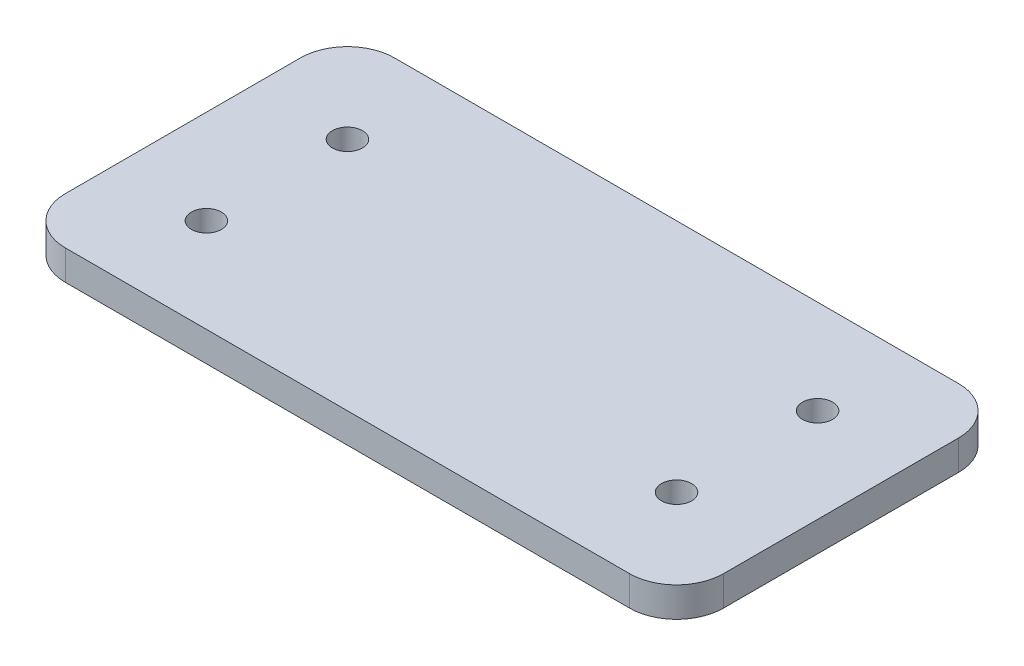
ISO-10303-21;
HEADER;
FILE_DESCRIPTION(('STEP AP214'),'2;1');
FILE_NAME('part.step','',(''),(''),'','','');
FILE_SCHEMA(('AUTOMOTIVE_DESIGN { 1 0 10303 214 1 1 1 1 }'));
ENDSEC;
DATA;
#1=APPLICATION_CONTEXT('core data for automotive mechanical design processes');
#2=APPLICATION_PROTOCOL_DEFINITION('international standard','automotive_design',2000,#1);
#3=PRODUCT_CONTEXT('',#1,'mechanical');
#4=PRODUCT('Part','Part','',(#3));
#5=PRODUCT_RELATED_PRODUCT_CATEGORY('part','',(#4));
#6=PRODUCT_DEFINITION_FORMATION('','',#4);
#7=PRODUCT_DEFINITION_CONTEXT('part definition',#1,'design');
#8=PRODUCT_DEFINITION('design','',#6,#7);
#9=PRODUCT_DEFINITION_SHAPE('','',#8);
#10=(LENGTH_UNIT() NAMED_UNIT(*) SI_UNIT(.MILLI.,.METRE.));
#11=(NAMED_UNIT(*) PLANE_ANGLE_UNIT() SI_UNIT($,.RADIAN.));
#12=(NAMED_UNIT(*) SI_UNIT($,.STERADIAN.) SOLID_ANGLE_UNIT());
#13=UNCERTAINTY_MEASURE_WITH_UNIT(LENGTH_MEASURE(1.E-05),#10,'distance_accuracy_value','');
#14=(GEOMETRIC_REPRESENTATION_CONTEXT(3) GLOBAL_UNCERTAINTY_ASSIGNED_CONTEXT((#13)) GLOBAL_UNIT_ASSIGNED_CONTEXT((#10,
#11,#12)) REPRESENTATION_CONTEXT('',''));
#15=CARTESIAN_POINT('',(0.,0.,0.));
#16=DIRECTION('',(0.,0.,1.));
#17=DIRECTION('',(1.,0.,0.));
#18=AXIS2_PLACEMENT_3D('',#15,#16,#17);
#19=CARTESIAN_POINT('',(35.,3.175,-17.5));
#20=DIRECTION('',(-1.,0.,0.));
#21=DIRECTION('',(0.,0.,1.));
#22=AXIS2_PLACEMENT_3D('',#19,#20,#21);
#23=PLANE('',#22);
#24=DIRECTION('',(0.,0.,-1.));
#25=VECTOR('',#24,1.);
#26=CARTESIAN_POINT('',(35.,3.175,-17.5));
#27=LINE('',#26,#25);
#28=CARTESIAN_POINT('',(35.,3.175,12.5));
#29=VERTEX_POINT('',#28);
#30=CARTESIAN_POINT('',(35.,3.175,-12.5));
#31=VERTEX_POINT('',#30);
#32=EDGE_CURVE('E120',#29,#31,#27,.T.);
#33=ORIENTED_EDGE('',*,*,#32,.F.);
#34=DIRECTION('',(0.,-1.,0.));
#35=VECTOR('',#34,1.);
#36=CARTESIAN_POINT('',(35.,3.175,12.5));
#37=LINE('',#36,#35);
#38=CARTESIAN_POINT('',(35.,0.,12.5));
#39=VERTEX_POINT('',#38);
#40=EDGE_CURVE('E105',#29,#39,#37,.T.);
#41=ORIENTED_EDGE('',*,*,#40,.T.);
#42=DIRECTION('',(0.,0.,-1.));
#43=VECTOR('',#42,1.);
#44=CARTESIAN_POINT('',(35.,0.,-17.5));
#45=LINE('',#44,#43);
#46=CARTESIAN_POINT('',(35.,0.,-12.5));
#47=VERTEX_POINT('',#46);
#48=EDGE_CURVE('E117',#39,#47,#45,.T.);
#49=ORIENTED_EDGE('',*,*,#48,.T.);
#50=DIRECTION('',(0.,-1.,0.));
#51=VECTOR('',#50,1.);
#52=CARTESIAN_POINT('',(35.,3.175,-12.5));
#53=LINE('',#52,#51);
#54=EDGE_CURVE('E122',#47,#31,#53,.F.);
#55=ORIENTED_EDGE('',*,*,#54,.T.);
#56=EDGE_LOOP('',(#33,#41,#49,#55));
#57=FACE_BOUND('',#56,.T.);
#58=ADVANCED_FACE('F35',(#57),#23,.F.);
#59=CARTESIAN_POINT('',(-35.,3.175,-17.5));
#60=DIRECTION('',(0.,0.,1.));
#61=DIRECTION('',(1.,0.,0.));
#62=AXIS2_PLACEMENT_3D('',#59,#60,#61);
#63=PLANE('',#62);
#64=DIRECTION('',(-1.,0.,0.));
#65=VECTOR('',#64,1.);
#66=CARTESIAN_POINT('',(-35.,3.175,-17.5));
#67=LINE('',#66,#65);
#68=CARTESIAN_POINT('',(30.,3.175,-17.5));
#69=VERTEX_POINT('',#68);
#70=CARTESIAN_POINT('',(-30.,3.175,-17.5));
#71=VERTEX_POINT('',#70);
#72=EDGE_CURVE('E166',#69,#71,#67,.T.);
#73=ORIENTED_EDGE('',*,*,#72,.F.);
#74=DIRECTION('',(0.,-1.,0.));
#75=VECTOR('',#74,1.);
#76=CARTESIAN_POINT('',(30.,3.175,-17.5));
#77=LINE('',#76,#75);
#78=CARTESIAN_POINT('',(30.,0.,-17.5));
#79=VERTEX_POINT('',#78);
#80=EDGE_CURVE('E159',#69,#79,#77,.T.);
#81=ORIENTED_EDGE('',*,*,#80,.T.);
#82=DIRECTION('',(-1.,0.,0.));
#83=VECTOR('',#82,1.);
#84=CARTESIAN_POINT('',(-35.,0.,-17.5));
#85=LINE('',#84,#83);
#86=CARTESIAN_POINT('',(-30.,0.,-17.5));
#87=VERTEX_POINT('',#86);
#88=EDGE_CURVE('E126',#79,#87,#85,.T.);
#89=ORIENTED_EDGE('',*,*,#88,.T.);
#90=DIRECTION('',(0.,-1.,0.));
#91=VECTOR('',#90,1.);
#92=CARTESIAN_POINT('',(-30.,3.175,-17.5));
#93=LINE('',#92,#91);
#94=EDGE_CURVE('E157',#87,#71,#93,.F.);
#95=ORIENTED_EDGE('',*,*,#94,.T.);
#96=EDGE_LOOP('',(#73,#81,#89,#95));
#97=FACE_BOUND('',#96,.T.);
#98=ADVANCED_FACE('F164',(#97),#63,.F.);
#99=CARTESIAN_POINT('',(-35.,3.175,-17.5));
#100=DIRECTION('',(1.,0.,0.));
#101=DIRECTION('',(0.,0.,-1.));
#102=AXIS2_PLACEMENT_3D('',#99,#100,#101);
#103=PLANE('',#102);
#104=DIRECTION('',(0.,0.,1.));
#105=VECTOR('',#104,1.);
#106=CARTESIAN_POINT('',(-35.,3.175,-17.5));
#107=LINE('',#106,#105);
#108=CARTESIAN_POINT('',(-35.,3.175,-12.5));
#109=VERTEX_POINT('',#108);
#110=CARTESIAN_POINT('',(-35.,3.175,12.5));
#111=VERTEX_POINT('',#110);
#112=EDGE_CURVE('E174',#109,#111,#107,.T.);
#113=ORIENTED_EDGE('',*,*,#112,.F.);
#114=DIRECTION('',(0.,-1.,0.));
#115=VECTOR('',#114,1.);
#116=CARTESIAN_POINT('',(-35.,3.175,-12.5));
#117=LINE('',#116,#115);
#118=CARTESIAN_POINT('',(-35.,0.,-12.5));
#119=VERTEX_POINT('',#118);
#120=EDGE_CURVE('E11',#109,#119,#117,.T.);
#121=ORIENTED_EDGE('',*,*,#120,.T.);
#122=DIRECTION('',(0.,0.,1.));
#123=VECTOR('',#122,1.);
#124=CARTESIAN_POINT('',(-35.,0.,-17.5));
#125=LINE('',#124,#123);
#126=CARTESIAN_POINT('',(-35.,0.,12.5));
#127=VERTEX_POINT('',#126);
#128=EDGE_CURVE('E130',#119,#127,#125,.T.);
#129=ORIENTED_EDGE('',*,*,#128,.T.);
#130=DIRECTION('',(0.,-1.,0.));
#131=VECTOR('',#130,1.);
#132=CARTESIAN_POINT('',(-35.,3.175,12.5));
#133=LINE('',#132,#131);
#134=EDGE_CURVE('E43',#127,#111,#133,.F.);
#135=ORIENTED_EDGE('',*,*,#134,.T.);
#136=EDGE_LOOP('',(#113,#121,#129,#135));
#137=FACE_BOUND('',#136,.T.);
#138=ADVANCED_FACE('F173',(#137),#103,.F.);
#139=CARTESIAN_POINT('',(-35.,3.175,17.5));
#140=DIRECTION('',(0.,0.,-1.));
#141=DIRECTION('',(-1.,0.,0.));
#142=AXIS2_PLACEMENT_3D('',#139,#140,#141);
#143=PLANE('',#142);
#144=DIRECTION('',(1.,0.,0.));
#145=VECTOR('',#144,1.);
#146=CARTESIAN_POINT('',(-35.,0.,17.5));
#147=LINE('',#146,#145);
#148=CARTESIAN_POINT('',(-30.,0.,17.5));
#149=VERTEX_POINT('',#148);
#150=CARTESIAN_POINT('',(30.,0.,17.5));
#151=VERTEX_POINT('',#150);
#152=EDGE_CURVE('E140',#149,#151,#147,.T.);
#153=ORIENTED_EDGE('',*,*,#152,.T.);
#154=DIRECTION('',(0.,-1.,0.));
#155=VECTOR('',#154,1.);
#156=CARTESIAN_POINT('',(30.,3.175,17.5));
#157=LINE('',#156,#155);
#158=CARTESIAN_POINT('',(30.,3.175,17.5));
#159=VERTEX_POINT('',#158);
#160=EDGE_CURVE('E106',#151,#159,#157,.F.);
#161=ORIENTED_EDGE('',*,*,#160,.T.);
#162=DIRECTION('',(1.,0.,0.));
#163=VECTOR('',#162,1.);
#164=CARTESIAN_POINT('',(-35.,3.175,17.5));
#165=LINE('',#164,#163);
#166=CARTESIAN_POINT('',(-30.,3.175,17.5));
#167=VERTEX_POINT('',#166);
#168=EDGE_CURVE('E136',#167,#159,#165,.T.);
#169=ORIENTED_EDGE('',*,*,#168,.F.);
#170=DIRECTION('',(0.,-1.,0.));
#171=VECTOR('',#170,1.);
#172=CARTESIAN_POINT('',(-30.,3.175,17.5));
#173=LINE('',#172,#171);
#174=EDGE_CURVE('E111',#167,#149,#173,.T.);
#175=ORIENTED_EDGE('',*,*,#174,.T.);
#176=EDGE_LOOP('',(#153,#161,#169,#175));
#177=FACE_BOUND('',#176,.T.);
#178=ADVANCED_FACE('F213',(#177),#143,.F.);
#179=CARTESIAN_POINT('',(0.,3.175,0.));
#180=DIRECTION('',(0.,1.,0.));
#181=DIRECTION('',(0.,0.,1.));
#182=AXIS2_PLACEMENT_3D('',#179,#180,#181);
#183=PLANE('',#182);
#184=CARTESIAN_POINT('',(25.,3.175,-7.5));
#185=DIRECTION('',(0.,1.,0.));
#186=DIRECTION('',(0.,0.,1.));
#187=AXIS2_PLACEMENT_3D('',#184,#185,#186);
#188=CIRCLE('',#187,1.6);
#189=CARTESIAN_POINT('',(25.,3.175,-5.9));
#190=VERTEX_POINT('',#189);
#191=EDGE_CURVE('E195',#190,#190,#188,.T.);
#192=ORIENTED_EDGE('',*,*,#191,.F.);
#193=EDGE_LOOP('',(#192));
#194=FACE_BOUND('',#193,.T.);
#195=CARTESIAN_POINT('',(25.,3.175,7.5));
#196=DIRECTION('',(0.,1.,0.));
#197=DIRECTION('',(0.,0.,1.));
#198=AXIS2_PLACEMENT_3D('',#195,#196,#197);
#199=CIRCLE('',#198,1.6);
#200=CARTESIAN_POINT('',(25.,3.175,9.1));
#201=VERTEX_POINT('',#200);
#202=EDGE_CURVE('E189',#201,#201,#199,.T.);
#203=ORIENTED_EDGE('',*,*,#202,.F.);
#204=EDGE_LOOP('',(#203));
#205=FACE_BOUND('',#204,.T.);
#206=CARTESIAN_POINT('',(-25.,3.175,7.5));
#207=DIRECTION('',(0.,1.,0.));
#208=DIRECTION('',(0.,0.,1.));
#209=AXIS2_PLACEMENT_3D('',#206,#207,#208);
#210=CIRCLE('',#209,1.6);
#211=CARTESIAN_POINT('',(-25.,3.175,9.1));
#212=VERTEX_POINT('',#211);
#213=EDGE_CURVE('E183',#212,#212,#210,.T.);
#214=ORIENTED_EDGE('',*,*,#213,.F.);
#215=EDGE_LOOP('',(#214));
#216=FACE_BOUND('',#215,.T.);
#217=CARTESIAN_POINT('',(-25.,3.175,-7.5));
#218=DIRECTION('',(0.,1.,0.));
#219=DIRECTION('',(0.,0.,1.));
#220=AXIS2_PLACEMENT_3D('',#217,#218,#219);
#221=CIRCLE('',#220,1.6);
#222=CARTESIAN_POINT('',(-25.,3.175,-5.9));
#223=VERTEX_POINT('',#222);
#224=EDGE_CURVE('E133',#223,#223,#221,.T.);
#225=ORIENTED_EDGE('',*,*,#224,.F.);
#226=EDGE_LOOP('',(#225));
#227=FACE_BOUND('',#226,.T.);
#228=ORIENTED_EDGE('',*,*,#168,.T.);
#229=CARTESIAN_POINT('',(30.,3.175,12.5));
#230=DIRECTION('',(0.,1.,0.));
#231=DIRECTION('',(0.,0.,1.));
#232=AXIS2_PLACEMENT_3D('',#229,#230,#231);
#233=CIRCLE('',#232,5.);
#234=EDGE_CURVE('E155',#159,#29,#233,.T.);
#235=ORIENTED_EDGE('',*,*,#234,.T.);
#236=ORIENTED_EDGE('',*,*,#32,.T.);
#237=CARTESIAN_POINT('',(30.,3.175,-12.5));
#238=DIRECTION('',(0.,1.,0.));
#239=DIRECTION('',(0.,0.,1.));
#240=AXIS2_PLACEMENT_3D('',#237,#238,#239);
#241=CIRCLE('',#240,5.);
#242=EDGE_CURVE('E153',#31,#69,#241,.T.);
#243=ORIENTED_EDGE('',*,*,#242,.T.);
#244=ORIENTED_EDGE('',*,*,#72,.T.);
#245=CARTESIAN_POINT('',(-30.,3.175,-12.5));
#246=DIRECTION('',(0.,1.,0.));
#247=DIRECTION('',(0.,0.,1.));
#248=AXIS2_PLACEMENT_3D('',#245,#246,#247);
#249=CIRCLE('',#248,5.);
#250=EDGE_CURVE('E56',#71,#109,#249,.T.);
#251=ORIENTED_EDGE('',*,*,#250,.T.);
#252=ORIENTED_EDGE('',*,*,#112,.T.);
#253=CARTESIAN_POINT('',(-30.,3.175,12.5));
#254=DIRECTION('',(0.,1.,0.));
#255=DIRECTION('',(0.,0.,1.));
#256=AXIS2_PLACEMENT_3D('',#253,#254,#255);
#257=CIRCLE('',#256,5.);
#258=EDGE_CURVE('E150',#111,#167,#257,.T.);
#259=ORIENTED_EDGE('',*,*,#258,.T.);
#260=EDGE_LOOP('',(#228,#235,#236,#243,#244,#251,#252,#259));
#261=FACE_BOUND('',#260,.T.);
#262=ADVANCED_FACE('F210',(#194,#205,#216,#227,#261),#183,.T.);
#263=CARTESIAN_POINT('',(0.,0.,0.));
#264=DIRECTION('',(0.,1.,0.));
#265=DIRECTION('',(0.,0.,1.));
#266=AXIS2_PLACEMENT_3D('',#263,#264,#265);
#267=PLANE('',#266);
#268=CARTESIAN_POINT('',(25.,0.,-7.5));
#269=DIRECTION('',(0.,1.,0.));
#270=DIRECTION('',(0.,0.,1.));
#271=AXIS2_PLACEMENT_3D('',#268,#269,#270);
#272=CIRCLE('',#271,1.6);
#273=CARTESIAN_POINT('',(25.,0.,-5.9));
#274=VERTEX_POINT('',#273);
#275=EDGE_CURVE('E192',#274,#274,#272,.T.);
#276=ORIENTED_EDGE('',*,*,#275,.T.);
#277=EDGE_LOOP('',(#276));
#278=FACE_BOUND('',#277,.T.);
#279=CARTESIAN_POINT('',(25.,0.,7.5));
#280=DIRECTION('',(0.,1.,0.));
#281=DIRECTION('',(0.,0.,1.));
#282=AXIS2_PLACEMENT_3D('',#279,#280,#281);
#283=CIRCLE('',#282,1.6);
#284=CARTESIAN_POINT('',(25.,0.,9.1));
#285=VERTEX_POINT('',#284);
#286=EDGE_CURVE('E186',#285,#285,#283,.T.);
#287=ORIENTED_EDGE('',*,*,#286,.T.);
#288=EDGE_LOOP('',(#287));
#289=FACE_BOUND('',#288,.T.);
#290=CARTESIAN_POINT('',(-25.,0.,7.5));
#291=DIRECTION('',(0.,1.,0.));
#292=DIRECTION('',(0.,0.,1.));
#293=AXIS2_PLACEMENT_3D('',#290,#291,#292);
#294=CIRCLE('',#293,1.6);
#295=CARTESIAN_POINT('',(-25.,0.,9.1));
#296=VERTEX_POINT('',#295);
#297=EDGE_CURVE('E181',#296,#296,#294,.T.);
#298=ORIENTED_EDGE('',*,*,#297,.T.);
#299=EDGE_LOOP('',(#298));
#300=FACE_BOUND('',#299,.T.);
#301=CARTESIAN_POINT('',(-25.,0.,-7.5));
#302=DIRECTION('',(0.,1.,0.));
#303=DIRECTION('',(0.,0.,1.));
#304=AXIS2_PLACEMENT_3D('',#301,#302,#303);
#305=CIRCLE('',#304,1.6);
#306=CARTESIAN_POINT('',(-25.,0.,-5.9));
#307=VERTEX_POINT('',#306);
#308=EDGE_CURVE('E127',#307,#307,#305,.T.);
#309=ORIENTED_EDGE('',*,*,#308,.T.);
#310=EDGE_LOOP('',(#309));
#311=FACE_BOUND('',#310,.T.);
#312=ORIENTED_EDGE('',*,*,#48,.F.);
#313=CARTESIAN_POINT('',(30.,0.,12.5));
#314=DIRECTION('',(0.,1.,0.));
#315=DIRECTION('',(0.,0.,1.));
#316=AXIS2_PLACEMENT_3D('',#313,#314,#315);
#317=CIRCLE('',#316,5.);
#318=EDGE_CURVE('E101',#39,#151,#317,.F.);
#319=ORIENTED_EDGE('',*,*,#318,.T.);
#320=ORIENTED_EDGE('',*,*,#152,.F.);
#321=CARTESIAN_POINT('',(-30.,0.,12.5));
#322=DIRECTION('',(0.,1.,0.));
#323=DIRECTION('',(0.,0.,1.));
#324=AXIS2_PLACEMENT_3D('',#321,#322,#323);
#325=CIRCLE('',#324,5.);
#326=EDGE_CURVE('E121',#149,#127,#325,.F.);
#327=ORIENTED_EDGE('',*,*,#326,.T.);
#328=ORIENTED_EDGE('',*,*,#128,.F.);
#329=CARTESIAN_POINT('',(-30.,0.,-12.5));
#330=DIRECTION('',(0.,1.,0.));
#331=DIRECTION('',(0.,0.,1.));
#332=AXIS2_PLACEMENT_3D('',#329,#330,#331);
#333=CIRCLE('',#332,5.);
#334=EDGE_CURVE('E144',#119,#87,#333,.F.);
#335=ORIENTED_EDGE('',*,*,#334,.T.);
#336=ORIENTED_EDGE('',*,*,#88,.F.);
#337=CARTESIAN_POINT('',(30.,0.,-12.5));
#338=DIRECTION('',(0.,1.,0.));
#339=DIRECTION('',(0.,0.,1.));
#340=AXIS2_PLACEMENT_3D('',#337,#338,#339);
#341=CIRCLE('',#340,5.);
#342=EDGE_CURVE('E112',#79,#47,#341,.F.);
#343=ORIENTED_EDGE('',*,*,#342,.T.);
#344=EDGE_LOOP('',(#312,#319,#320,#327,#328,#335,#336,#343));
#345=FACE_BOUND('',#344,.T.);
#346=ADVANCED_FACE('F124',(#278,#289,#300,#311,#345),#267,.F.);
#347=CARTESIAN_POINT('',(-25.,0.,-7.5));
#348=DIRECTION('',(0.,1.,0.));
#349=DIRECTION('',(0.,0.,1.));
#350=AXIS2_PLACEMENT_3D('',#347,#348,#349);
#351=CYLINDRICAL_SURFACE('',#350,1.6);
#352=ORIENTED_EDGE('',*,*,#308,.F.);
#353=EDGE_LOOP('',(#352));
#354=FACE_BOUND('',#353,.T.);
#355=ORIENTED_EDGE('',*,*,#224,.T.);
#356=EDGE_LOOP('',(#355));
#357=FACE_BOUND('',#356,.T.);
#358=ADVANCED_FACE('F283',(#354,#357),#351,.F.);
#359=CARTESIAN_POINT('',(-25.,0.,7.5));
#360=DIRECTION('',(0.,1.,0.));
#361=DIRECTION('',(0.,0.,1.));
#362=AXIS2_PLACEMENT_3D('',#359,#360,#361);
#363=CYLINDRICAL_SURFACE('',#362,1.6);
#364=ORIENTED_EDGE('',*,*,#297,.F.);
#365=EDGE_LOOP('',(#364));
#366=FACE_BOUND('',#365,.T.);
#367=ORIENTED_EDGE('',*,*,#213,.T.);
#368=EDGE_LOOP('',(#367));
#369=FACE_BOUND('',#368,.T.);
#370=ADVANCED_FACE('F274',(#366,#369),#363,.F.);
#371=CARTESIAN_POINT('',(25.,0.,7.5));
#372=DIRECTION('',(0.,1.,0.));
#373=DIRECTION('',(0.,0.,1.));
#374=AXIS2_PLACEMENT_3D('',#371,#372,#373);
#375=CYLINDRICAL_SURFACE('',#374,1.6);
#376=ORIENTED_EDGE('',*,*,#286,.F.);
#377=EDGE_LOOP('',(#376));
#378=FACE_BOUND('',#377,.T.);
#379=ORIENTED_EDGE('',*,*,#202,.T.);
#380=EDGE_LOOP('',(#379));
#381=FACE_BOUND('',#380,.T.);
#382=ADVANCED_FACE('F206',(#378,#381),#375,.F.);
#383=CARTESIAN_POINT('',(25.,0.,-7.5));
#384=DIRECTION('',(0.,1.,0.));
#385=DIRECTION('',(0.,0.,1.));
#386=AXIS2_PLACEMENT_3D('',#383,#384,#385);
#387=CYLINDRICAL_SURFACE('',#386,1.6);
#388=ORIENTED_EDGE('',*,*,#275,.F.);
#389=EDGE_LOOP('',(#388));
#390=FACE_BOUND('',#389,.T.);
#391=ORIENTED_EDGE('',*,*,#191,.T.);
#392=EDGE_LOOP('',(#391));
#393=FACE_BOUND('',#392,.T.);
#394=ADVANCED_FACE('F203',(#390,#393),#387,.F.);
#395=CARTESIAN_POINT('',(30.,3.175,12.5));
#396=DIRECTION('',(0.,-1.,0.));
#397=DIRECTION('',(0.,0.,-1.));
#398=AXIS2_PLACEMENT_3D('',#395,#396,#397);
#399=CYLINDRICAL_SURFACE('',#398,5.);
#400=ORIENTED_EDGE('',*,*,#234,.F.);
#401=ORIENTED_EDGE('',*,*,#160,.F.);
#402=ORIENTED_EDGE('',*,*,#318,.F.);
#403=ORIENTED_EDGE('',*,*,#40,.F.);
#404=EDGE_LOOP('',(#400,#401,#402,#403));
#405=FACE_BOUND('',#404,.T.);
#406=ADVANCED_FACE('F104',(#405),#399,.T.);
#407=CARTESIAN_POINT('',(30.,3.175,-12.5));
#408=DIRECTION('',(0.,-1.,0.));
#409=DIRECTION('',(0.,0.,-1.));
#410=AXIS2_PLACEMENT_3D('',#407,#408,#409);
#411=CYLINDRICAL_SURFACE('',#410,5.);
#412=ORIENTED_EDGE('',*,*,#242,.F.);
#413=ORIENTED_EDGE('',*,*,#54,.F.);
#414=ORIENTED_EDGE('',*,*,#342,.F.);
#415=ORIENTED_EDGE('',*,*,#80,.F.);
#416=EDGE_LOOP('',(#412,#413,#414,#415));
#417=FACE_BOUND('',#416,.T.);
#418=ADVANCED_FACE('F228',(#417),#411,.T.);
#419=CARTESIAN_POINT('',(-30.,3.175,-12.5));
#420=DIRECTION('',(0.,-1.,0.));
#421=DIRECTION('',(0.,0.,-1.));
#422=AXIS2_PLACEMENT_3D('',#419,#420,#421);
#423=CYLINDRICAL_SURFACE('',#422,5.);
#424=ORIENTED_EDGE('',*,*,#250,.F.);
#425=ORIENTED_EDGE('',*,*,#94,.F.);
#426=ORIENTED_EDGE('',*,*,#334,.F.);
#427=ORIENTED_EDGE('',*,*,#120,.F.);
#428=EDGE_LOOP('',(#424,#425,#426,#427));
#429=FACE_BOUND('',#428,.T.);
#430=ADVANCED_FACE('F172',(#429),#423,.T.);
#431=CARTESIAN_POINT('',(-30.,3.175,12.5));
#432=DIRECTION('',(0.,-1.,0.));
#433=DIRECTION('',(0.,0.,-1.));
#434=AXIS2_PLACEMENT_3D('',#431,#432,#433);
#435=CYLINDRICAL_SURFACE('',#434,5.);
#436=ORIENTED_EDGE('',*,*,#258,.F.);
#437=ORIENTED_EDGE('',*,*,#134,.F.);
#438=ORIENTED_EDGE('',*,*,#326,.F.);
#439=ORIENTED_EDGE('',*,*,#174,.F.);
#440=EDGE_LOOP('',(#436,#437,#438,#439));
#441=FACE_BOUND('',#440,.T.);
#442=ADVANCED_FACE('F37',(#441),#435,.T.);
#443=CLOSED_SHELL('',(#58,#98,#138,#178,#262,#346,#358,#370,#382,#394,#406,#418,#430,#442));
#444=MANIFOLD_SOLID_BREP('B2',#443);
#445=ADVANCED_BREP_SHAPE_REPRESENTATION('',(#18,#444),#14);
#446=SHAPE_DEFINITION_REPRESENTATION(#9,#445);
ENDSEC;
END-ISO-10303-21;
